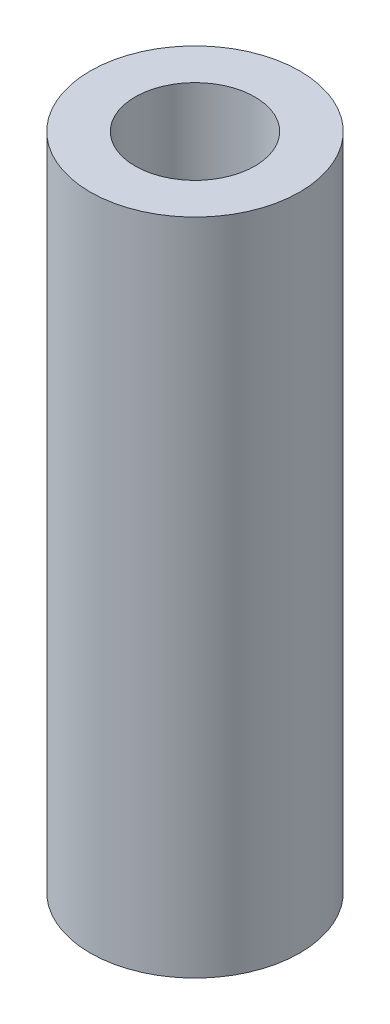
ISO-10303-21;
HEADER;
FILE_DESCRIPTION(('STEP AP214'),'2;1');
FILE_NAME('part.step','',(''),(''),'','','');
FILE_SCHEMA(('AUTOMOTIVE_DESIGN { 1 0 10303 214 1 1 1 1 }'));
ENDSEC;
DATA;
#1=APPLICATION_CONTEXT('core data for automotive mechanical design processes');
#2=APPLICATION_PROTOCOL_DEFINITION('international standard','automotive_design',2000,#1);
#3=PRODUCT_CONTEXT('',#1,'mechanical');
#4=PRODUCT('Part','Part','',(#3));
#5=PRODUCT_RELATED_PRODUCT_CATEGORY('part','',(#4));
#6=PRODUCT_DEFINITION_FORMATION('','',#4);
#7=PRODUCT_DEFINITION_CONTEXT('part definition',#1,'design');
#8=PRODUCT_DEFINITION('design','',#6,#7);
#9=PRODUCT_DEFINITION_SHAPE('','',#8);
#10=(LENGTH_UNIT() NAMED_UNIT(*) SI_UNIT(.MILLI.,.METRE.));
#11=(NAMED_UNIT(*) PLANE_ANGLE_UNIT() SI_UNIT($,.RADIAN.));
#12=(NAMED_UNIT(*) SI_UNIT($,.STERADIAN.) SOLID_ANGLE_UNIT());
#13=UNCERTAINTY_MEASURE_WITH_UNIT(LENGTH_MEASURE(1.E-05),#10,'distance_accuracy_value','');
#14=(GEOMETRIC_REPRESENTATION_CONTEXT(3) GLOBAL_UNCERTAINTY_ASSIGNED_CONTEXT((#13)) GLOBAL_UNIT_ASSIGNED_CONTEXT((#10,
#11,#12)) REPRESENTATION_CONTEXT('',''));
#15=CARTESIAN_POINT('',(0.,0.,0.));
#16=DIRECTION('',(0.,0.,1.));
#17=DIRECTION('',(1.,0.,0.));
#18=AXIS2_PLACEMENT_3D('',#15,#16,#17);
#19=CARTESIAN_POINT('',(0.,22.,0.));
#20=DIRECTION('',(0.,1.,0.));
#21=DIRECTION('',(0.,0.,1.));
#22=AXIS2_PLACEMENT_3D('',#19,#20,#21);
#23=PLANE('',#22);
#24=CARTESIAN_POINT('',(0.,22.,0.));
#25=DIRECTION('',(0.,1.,0.));
#26=DIRECTION('',(0.,0.,1.));
#27=AXIS2_PLACEMENT_3D('',#24,#25,#26);
#28=CIRCLE('',#27,3.5);
#29=CARTESIAN_POINT('',(0.,22.,3.5));
#30=VERTEX_POINT('',#29);
#31=EDGE_CURVE('E10',#30,#30,#28,.T.);
#32=ORIENTED_EDGE('',*,*,#31,.T.);
#33=EDGE_LOOP('',(#32));
#34=FACE_BOUND('',#33,.T.);
#35=CARTESIAN_POINT('',(0.,22.,0.));
#36=DIRECTION('',(0.,1.,0.));
#37=DIRECTION('',(0.,0.,1.));
#38=AXIS2_PLACEMENT_3D('',#35,#36,#37);
#39=CIRCLE('',#38,2.);
#40=CARTESIAN_POINT('',(0.,22.,2.));
#41=VERTEX_POINT('',#40);
#42=EDGE_CURVE('E45',#41,#41,#39,.T.);
#43=ORIENTED_EDGE('',*,*,#42,.F.);
#44=EDGE_LOOP('',(#43));
#45=FACE_BOUND('',#44,.T.);
#46=ADVANCED_FACE('F34',(#34,#45),#23,.T.);
#47=CARTESIAN_POINT('',(0.,0.,0.));
#48=DIRECTION('',(0.,1.,0.));
#49=DIRECTION('',(0.,0.,1.));
#50=AXIS2_PLACEMENT_3D('',#47,#48,#49);
#51=PLANE('',#50);
#52=CARTESIAN_POINT('',(0.,0.,0.));
#53=DIRECTION('',(0.,1.,0.));
#54=DIRECTION('',(0.,0.,1.));
#55=AXIS2_PLACEMENT_3D('',#52,#53,#54);
#56=CIRCLE('',#55,3.5);
#57=CARTESIAN_POINT('',(0.,0.,3.5));
#58=VERTEX_POINT('',#57);
#59=EDGE_CURVE('E38',#58,#58,#56,.T.);
#60=ORIENTED_EDGE('',*,*,#59,.F.);
#61=EDGE_LOOP('',(#60));
#62=FACE_BOUND('',#61,.T.);
#63=CARTESIAN_POINT('',(0.,0.,0.));
#64=DIRECTION('',(0.,1.,0.));
#65=DIRECTION('',(0.,0.,1.));
#66=AXIS2_PLACEMENT_3D('',#63,#64,#65);
#67=CIRCLE('',#66,2.);
#68=CARTESIAN_POINT('',(0.,0.,2.));
#69=VERTEX_POINT('',#68);
#70=EDGE_CURVE('E47',#69,#69,#67,.T.);
#71=ORIENTED_EDGE('',*,*,#70,.T.);
#72=EDGE_LOOP('',(#71));
#73=FACE_BOUND('',#72,.T.);
#74=ADVANCED_FACE('F57',(#62,#73),#51,.F.);
#75=CARTESIAN_POINT('',(0.,22.,0.));
#76=DIRECTION('',(0.,-1.,0.));
#77=DIRECTION('',(0.,0.,-1.));
#78=AXIS2_PLACEMENT_3D('',#75,#76,#77);
#79=CYLINDRICAL_SURFACE('',#78,3.5);
#80=ORIENTED_EDGE('',*,*,#31,.F.);
#81=EDGE_LOOP('',(#80));
#82=FACE_BOUND('',#81,.T.);
#83=ORIENTED_EDGE('',*,*,#59,.T.);
#84=EDGE_LOOP('',(#83));
#85=FACE_BOUND('',#84,.T.);
#86=ADVANCED_FACE('F36',(#82,#85),#79,.T.);
#87=CARTESIAN_POINT('',(0.,22.,0.));
#88=DIRECTION('',(0.,-1.,0.));
#89=DIRECTION('',(0.,0.,-1.));
#90=AXIS2_PLACEMENT_3D('',#87,#88,#89);
#91=CYLINDRICAL_SURFACE('',#90,2.);
#92=ORIENTED_EDGE('',*,*,#42,.T.);
#93=EDGE_LOOP('',(#92));
#94=FACE_BOUND('',#93,.T.);
#95=ORIENTED_EDGE('',*,*,#70,.F.);
#96=EDGE_LOOP('',(#95));
#97=FACE_BOUND('',#96,.T.);
#98=ADVANCED_FACE('F53',(#94,#97),#91,.F.);
#99=CLOSED_SHELL('',(#46,#74,#86,#98));
#100=MANIFOLD_SOLID_BREP('B2',#99);
#101=ADVANCED_BREP_SHAPE_REPRESENTATION('',(#18,#100),#14);
#102=SHAPE_DEFINITION_REPRESENTATION(#9,#101);
ENDSEC;
END-ISO-10303-21;
